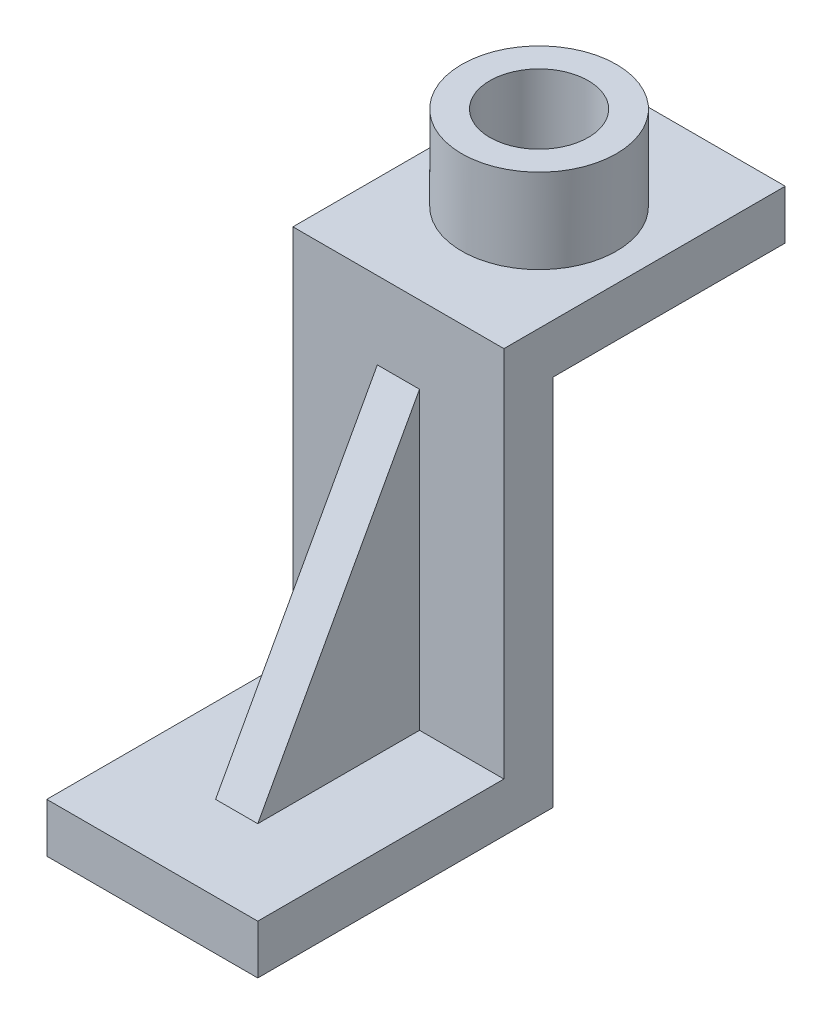
ISO-10303-21;
HEADER;
FILE_DESCRIPTION(('STEP AP214'),'2;1');
FILE_NAME('part.step','',(''),(''),'','','');
FILE_SCHEMA(('AUTOMOTIVE_DESIGN { 1 0 10303 214 1 1 1 1 }'));
ENDSEC;
DATA;
#1=APPLICATION_CONTEXT('core data for automotive mechanical design processes');
#2=APPLICATION_PROTOCOL_DEFINITION('international standard','automotive_design',2000,#1);
#3=PRODUCT_CONTEXT('',#1,'mechanical');
#4=PRODUCT('Part','Part','',(#3));
#5=PRODUCT_RELATED_PRODUCT_CATEGORY('part','',(#4));
#6=PRODUCT_DEFINITION_FORMATION('','',#4);
#7=PRODUCT_DEFINITION_CONTEXT('part definition',#1,'design');
#8=PRODUCT_DEFINITION('design','',#6,#7);
#9=PRODUCT_DEFINITION_SHAPE('','',#8);
#10=(LENGTH_UNIT() NAMED_UNIT(*) SI_UNIT(.MILLI.,.METRE.));
#11=(NAMED_UNIT(*) PLANE_ANGLE_UNIT() SI_UNIT($,.RADIAN.));
#12=(NAMED_UNIT(*) SI_UNIT($,.STERADIAN.) SOLID_ANGLE_UNIT());
#13=UNCERTAINTY_MEASURE_WITH_UNIT(LENGTH_MEASURE(1.E-05),#10,'distance_accuracy_value','');
#14=(GEOMETRIC_REPRESENTATION_CONTEXT(3) GLOBAL_UNCERTAINTY_ASSIGNED_CONTEXT((#13)) GLOBAL_UNIT_ASSIGNED_CONTEXT((#10,
#11,#12)) REPRESENTATION_CONTEXT('',''));
#15=CARTESIAN_POINT('',(0.,0.,0.));
#16=DIRECTION('',(0.,0.,1.));
#17=DIRECTION('',(1.,0.,0.));
#18=AXIS2_PLACEMENT_3D('',#15,#16,#17);
#19=CARTESIAN_POINT('',(0.,0.,7.));
#20=DIRECTION('',(0.,0.,-1.));
#21=DIRECTION('',(-1.,0.,0.));
#22=AXIS2_PLACEMENT_3D('',#19,#20,#21);
#23=PLANE('',#22);
#24=DIRECTION('',(-1.,0.,0.));
#25=VECTOR('',#24,1.);
#26=CARTESIAN_POINT('',(3.,19.,7.));
#27=LINE('',#26,#25);
#28=CARTESIAN_POINT('',(3.,19.,7.));
#29=VERTEX_POINT('',#28);
#30=CARTESIAN_POINT('',(-3.,19.,7.));
#31=VERTEX_POINT('',#30);
#32=EDGE_CURVE('E64',#29,#31,#27,.T.);
#33=ORIENTED_EDGE('',*,*,#32,.F.);
#34=DIRECTION('',(0.,1.,0.));
#35=VECTOR('',#34,1.);
#36=CARTESIAN_POINT('',(3.,-23.,7.));
#37=LINE('',#36,#35);
#38=CARTESIAN_POINT('',(3.,-23.,7.));
#39=VERTEX_POINT('',#38);
#40=EDGE_CURVE('E164',#39,#29,#37,.T.);
#41=ORIENTED_EDGE('',*,*,#40,.F.);
#42=DIRECTION('',(-1.,0.,0.));
#43=VECTOR('',#42,1.);
#44=CARTESIAN_POINT('',(15.,-23.,7.));
#45=LINE('',#44,#43);
#46=CARTESIAN_POINT('',(15.,-23.,7.));
#47=VERTEX_POINT('',#46);
#48=EDGE_CURVE('E188',#47,#39,#45,.T.);
#49=ORIENTED_EDGE('',*,*,#48,.F.);
#50=DIRECTION('',(0.,1.,0.));
#51=VECTOR('',#50,1.);
#52=CARTESIAN_POINT('',(15.,-30.,7.));
#53=LINE('',#52,#51);
#54=CARTESIAN_POINT('',(15.,30.,7.));
#55=VERTEX_POINT('',#54);
#56=EDGE_CURVE('E209',#47,#55,#53,.T.);
#57=ORIENTED_EDGE('',*,*,#56,.T.);
#58=DIRECTION('',(-1.,0.,0.));
#59=VECTOR('',#58,1.);
#60=CARTESIAN_POINT('',(-15.,30.,7.));
#61=LINE('',#60,#59);
#62=CARTESIAN_POINT('',(-15.,30.,7.));
#63=VERTEX_POINT('',#62);
#64=EDGE_CURVE('E212',#55,#63,#61,.T.);
#65=ORIENTED_EDGE('',*,*,#64,.T.);
#66=DIRECTION('',(0.,-1.,0.));
#67=VECTOR('',#66,1.);
#68=CARTESIAN_POINT('',(-15.,-30.,7.));
#69=LINE('',#68,#67);
#70=CARTESIAN_POINT('',(-15.,-23.,7.));
#71=VERTEX_POINT('',#70);
#72=EDGE_CURVE('E216',#63,#71,#69,.T.);
#73=ORIENTED_EDGE('',*,*,#72,.T.);
#74=CARTESIAN_POINT('',(-3.,-23.,7.));
#75=VERTEX_POINT('',#74);
#76=EDGE_CURVE('E182',#75,#71,#45,.T.);
#77=ORIENTED_EDGE('',*,*,#76,.F.);
#78=DIRECTION('',(0.,1.,0.));
#79=VECTOR('',#78,1.);
#80=CARTESIAN_POINT('',(-3.,-23.,7.));
#81=LINE('',#80,#79);
#82=EDGE_CURVE('E155',#75,#31,#81,.T.);
#83=ORIENTED_EDGE('',*,*,#82,.T.);
#84=EDGE_LOOP('',(#33,#41,#49,#57,#65,#73,#77,#83));
#85=FACE_BOUND('',#84,.T.);
#86=ADVANCED_FACE('F39',(#85),#23,.F.);
#87=CARTESIAN_POINT('',(15.,-30.,7.));
#88=DIRECTION('',(-1.,0.,0.));
#89=DIRECTION('',(0.,0.,1.));
#90=AXIS2_PLACEMENT_3D('',#87,#88,#89);
#91=PLANE('',#90);
#92=DIRECTION('',(0.,1.,0.));
#93=VECTOR('',#92,1.);
#94=CARTESIAN_POINT('',(15.,-30.,0.));
#95=LINE('',#94,#93);
#96=CARTESIAN_POINT('',(15.,-30.,0.));
#97=VERTEX_POINT('',#96);
#98=CARTESIAN_POINT('',(15.,23.,0.));
#99=VERTEX_POINT('',#98);
#100=EDGE_CURVE('E149',#97,#99,#95,.T.);
#101=ORIENTED_EDGE('',*,*,#100,.T.);
#102=DIRECTION('',(0.,0.,1.));
#103=VECTOR('',#102,1.);
#104=CARTESIAN_POINT('',(15.,23.,-33.));
#105=LINE('',#104,#103);
#106=CARTESIAN_POINT('',(15.,23.,-33.));
#107=VERTEX_POINT('',#106);
#108=EDGE_CURVE('E129',#107,#99,#105,.T.);
#109=ORIENTED_EDGE('',*,*,#108,.F.);
#110=DIRECTION('',(0.,-1.,0.));
#111=VECTOR('',#110,1.);
#112=CARTESIAN_POINT('',(15.,30.,-33.));
#113=LINE('',#112,#111);
#114=CARTESIAN_POINT('',(15.,30.,-33.));
#115=VERTEX_POINT('',#114);
#116=EDGE_CURVE('E137',#115,#107,#113,.T.);
#117=ORIENTED_EDGE('',*,*,#116,.F.);
#118=DIRECTION('',(0.,0.,-1.));
#119=VECTOR('',#118,1.);
#120=CARTESIAN_POINT('',(15.,30.,7.));
#121=LINE('',#120,#119);
#122=EDGE_CURVE('E49',#55,#115,#121,.T.);
#123=ORIENTED_EDGE('',*,*,#122,.F.);
#124=ORIENTED_EDGE('',*,*,#56,.F.);
#125=DIRECTION('',(0.,0.,-1.));
#126=VECTOR('',#125,1.);
#127=CARTESIAN_POINT('',(15.,-23.,42.));
#128=LINE('',#127,#126);
#129=CARTESIAN_POINT('',(15.,-23.,42.));
#130=VERTEX_POINT('',#129);
#131=EDGE_CURVE('E205',#130,#47,#128,.T.);
#132=ORIENTED_EDGE('',*,*,#131,.F.);
#133=DIRECTION('',(0.,1.,0.));
#134=VECTOR('',#133,1.);
#135=CARTESIAN_POINT('',(15.,-30.,42.));
#136=LINE('',#135,#134);
#137=CARTESIAN_POINT('',(15.,-30.,42.));
#138=VERTEX_POINT('',#137);
#139=EDGE_CURVE('E192',#138,#130,#136,.T.);
#140=ORIENTED_EDGE('',*,*,#139,.F.);
#141=DIRECTION('',(0.,0.,-1.));
#142=VECTOR('',#141,1.);
#143=CARTESIAN_POINT('',(15.,-30.,7.));
#144=LINE('',#143,#142);
#145=EDGE_CURVE('E220',#138,#97,#144,.T.);
#146=ORIENTED_EDGE('',*,*,#145,.T.);
#147=EDGE_LOOP('',(#101,#109,#117,#123,#124,#132,#140,#146));
#148=FACE_BOUND('',#147,.T.);
#149=ADVANCED_FACE('F41',(#148),#91,.F.);
#150=CARTESIAN_POINT('',(-15.,30.,7.));
#151=DIRECTION('',(0.,-1.,0.));
#152=DIRECTION('',(0.,0.,-1.));
#153=AXIS2_PLACEMENT_3D('',#150,#151,#152);
#154=PLANE('',#153);
#155=CARTESIAN_POINT('',(0.,30.,-13.));
#156=DIRECTION('',(0.,-1.,0.));
#157=DIRECTION('',(0.,0.,-1.));
#158=AXIS2_PLACEMENT_3D('',#155,#156,#157);
#159=CIRCLE('',#158,11.);
#160=CARTESIAN_POINT('',(0.,30.,-24.));
#161=VERTEX_POINT('',#160);
#162=EDGE_CURVE('E11',#161,#161,#159,.F.);
#163=ORIENTED_EDGE('',*,*,#162,.F.);
#164=EDGE_LOOP('',(#163));
#165=FACE_BOUND('',#164,.T.);
#166=ORIENTED_EDGE('',*,*,#122,.T.);
#167=DIRECTION('',(1.,0.,0.));
#168=VECTOR('',#167,1.);
#169=CARTESIAN_POINT('',(15.,30.,-33.));
#170=LINE('',#169,#168);
#171=CARTESIAN_POINT('',(-15.,30.,-33.));
#172=VERTEX_POINT('',#171);
#173=EDGE_CURVE('E143',#172,#115,#170,.T.);
#174=ORIENTED_EDGE('',*,*,#173,.F.);
#175=DIRECTION('',(0.,0.,-1.));
#176=VECTOR('',#175,1.);
#177=CARTESIAN_POINT('',(-15.,30.,7.));
#178=LINE('',#177,#176);
#179=EDGE_CURVE('E234',#63,#172,#178,.T.);
#180=ORIENTED_EDGE('',*,*,#179,.F.);
#181=ORIENTED_EDGE('',*,*,#64,.F.);
#182=EDGE_LOOP('',(#166,#174,#180,#181));
#183=FACE_BOUND('',#182,.T.);
#184=ADVANCED_FACE('F240',(#165,#183),#154,.F.);
#185=CARTESIAN_POINT('',(-15.,-30.,7.));
#186=DIRECTION('',(1.,0.,0.));
#187=DIRECTION('',(0.,0.,-1.));
#188=AXIS2_PLACEMENT_3D('',#185,#186,#187);
#189=PLANE('',#188);
#190=ORIENTED_EDGE('',*,*,#179,.T.);
#191=DIRECTION('',(0.,1.,0.));
#192=VECTOR('',#191,1.);
#193=CARTESIAN_POINT('',(-15.,30.,-33.));
#194=LINE('',#193,#192);
#195=CARTESIAN_POINT('',(-15.,23.,-33.));
#196=VERTEX_POINT('',#195);
#197=EDGE_CURVE('E136',#196,#172,#194,.T.);
#198=ORIENTED_EDGE('',*,*,#197,.F.);
#199=DIRECTION('',(0.,0.,1.));
#200=VECTOR('',#199,1.);
#201=CARTESIAN_POINT('',(-15.,23.,-33.));
#202=LINE('',#201,#200);
#203=CARTESIAN_POINT('',(-15.,23.,0.));
#204=VERTEX_POINT('',#203);
#205=EDGE_CURVE('E131',#196,#204,#202,.T.);
#206=ORIENTED_EDGE('',*,*,#205,.T.);
#207=DIRECTION('',(0.,-1.,0.));
#208=VECTOR('',#207,1.);
#209=CARTESIAN_POINT('',(-15.,-30.,0.));
#210=LINE('',#209,#208);
#211=CARTESIAN_POINT('',(-15.,-30.,0.));
#212=VERTEX_POINT('',#211);
#213=EDGE_CURVE('E223',#204,#212,#210,.T.);
#214=ORIENTED_EDGE('',*,*,#213,.T.);
#215=DIRECTION('',(0.,0.,-1.));
#216=VECTOR('',#215,1.);
#217=CARTESIAN_POINT('',(-15.,-30.,7.));
#218=LINE('',#217,#216);
#219=CARTESIAN_POINT('',(-15.,-30.,42.));
#220=VERTEX_POINT('',#219);
#221=EDGE_CURVE('E230',#220,#212,#218,.T.);
#222=ORIENTED_EDGE('',*,*,#221,.F.);
#223=DIRECTION('',(0.,-1.,0.));
#224=VECTOR('',#223,1.);
#225=CARTESIAN_POINT('',(-15.,-23.,42.));
#226=LINE('',#225,#224);
#227=CARTESIAN_POINT('',(-15.,-23.,42.));
#228=VERTEX_POINT('',#227);
#229=EDGE_CURVE('E183',#228,#220,#226,.T.);
#230=ORIENTED_EDGE('',*,*,#229,.F.);
#231=DIRECTION('',(0.,0.,-1.));
#232=VECTOR('',#231,1.);
#233=CARTESIAN_POINT('',(-15.,-23.,42.));
#234=LINE('',#233,#232);
#235=EDGE_CURVE('E198',#228,#71,#234,.T.);
#236=ORIENTED_EDGE('',*,*,#235,.T.);
#237=ORIENTED_EDGE('',*,*,#72,.F.);
#238=EDGE_LOOP('',(#190,#198,#206,#214,#222,#230,#236,#237));
#239=FACE_BOUND('',#238,.T.);
#240=ADVANCED_FACE('F258',(#239),#189,.F.);
#241=CARTESIAN_POINT('',(-15.,-30.,7.));
#242=DIRECTION('',(0.,1.,0.));
#243=DIRECTION('',(0.,0.,1.));
#244=AXIS2_PLACEMENT_3D('',#241,#242,#243);
#245=PLANE('',#244);
#246=DIRECTION('',(1.,0.,0.));
#247=VECTOR('',#246,1.);
#248=CARTESIAN_POINT('',(-15.,-30.,0.));
#249=LINE('',#248,#247);
#250=EDGE_CURVE('E213',#212,#97,#249,.T.);
#251=ORIENTED_EDGE('',*,*,#250,.T.);
#252=ORIENTED_EDGE('',*,*,#145,.F.);
#253=DIRECTION('',(1.,0.,0.));
#254=VECTOR('',#253,1.);
#255=CARTESIAN_POINT('',(-15.,-30.,42.));
#256=LINE('',#255,#254);
#257=EDGE_CURVE('E187',#220,#138,#256,.T.);
#258=ORIENTED_EDGE('',*,*,#257,.F.);
#259=ORIENTED_EDGE('',*,*,#221,.T.);
#260=EDGE_LOOP('',(#251,#252,#258,#259));
#261=FACE_BOUND('',#260,.T.);
#262=ADVANCED_FACE('F256',(#261),#245,.F.);
#263=CARTESIAN_POINT('',(0.,0.,0.));
#264=DIRECTION('',(0.,0.,-1.));
#265=DIRECTION('',(-1.,0.,0.));
#266=AXIS2_PLACEMENT_3D('',#263,#264,#265);
#267=PLANE('',#266);
#268=DIRECTION('',(-1.,0.,0.));
#269=VECTOR('',#268,1.);
#270=CARTESIAN_POINT('',(15.,23.,0.));
#271=LINE('',#270,#269);
#272=EDGE_CURVE('E56',#99,#204,#271,.T.);
#273=ORIENTED_EDGE('',*,*,#272,.F.);
#274=ORIENTED_EDGE('',*,*,#100,.F.);
#275=ORIENTED_EDGE('',*,*,#250,.F.);
#276=ORIENTED_EDGE('',*,*,#213,.F.);
#277=EDGE_LOOP('',(#273,#274,#275,#276));
#278=FACE_BOUND('',#277,.T.);
#279=ADVANCED_FACE('F255',(#278),#267,.T.);
#280=CARTESIAN_POINT('',(15.,-23.,42.));
#281=DIRECTION('',(0.,-1.,0.));
#282=DIRECTION('',(1.,0.,0.));
#283=AXIS2_PLACEMENT_3D('',#280,#281,#282);
#284=PLANE('',#283);
#285=ORIENTED_EDGE('',*,*,#48,.T.);
#286=DIRECTION('',(0.,0.,-1.));
#287=VECTOR('',#286,1.);
#288=CARTESIAN_POINT('',(3.,-23.,30.));
#289=LINE('',#288,#287);
#290=CARTESIAN_POINT('',(3.,-23.,30.));
#291=VERTEX_POINT('',#290);
#292=EDGE_CURVE('E160',#291,#39,#289,.T.);
#293=ORIENTED_EDGE('',*,*,#292,.F.);
#294=DIRECTION('',(-1.,0.,0.));
#295=VECTOR('',#294,1.);
#296=CARTESIAN_POINT('',(3.,-23.,30.));
#297=LINE('',#296,#295);
#298=CARTESIAN_POINT('',(-3.,-23.,30.));
#299=VERTEX_POINT('',#298);
#300=EDGE_CURVE('E171',#291,#299,#297,.T.);
#301=ORIENTED_EDGE('',*,*,#300,.T.);
#302=DIRECTION('',(0.,0.,-1.));
#303=VECTOR('',#302,1.);
#304=CARTESIAN_POINT('',(-3.,-23.,30.));
#305=LINE('',#304,#303);
#306=EDGE_CURVE('E151',#299,#75,#305,.T.);
#307=ORIENTED_EDGE('',*,*,#306,.T.);
#308=ORIENTED_EDGE('',*,*,#76,.T.);
#309=ORIENTED_EDGE('',*,*,#235,.F.);
#310=DIRECTION('',(-1.,0.,0.));
#311=VECTOR('',#310,1.);
#312=CARTESIAN_POINT('',(15.,-23.,42.));
#313=LINE('',#312,#311);
#314=EDGE_CURVE('E195',#130,#228,#313,.T.);
#315=ORIENTED_EDGE('',*,*,#314,.F.);
#316=ORIENTED_EDGE('',*,*,#131,.T.);
#317=EDGE_LOOP('',(#285,#293,#301,#307,#308,#309,#315,#316));
#318=FACE_BOUND('',#317,.T.);
#319=ADVANCED_FACE('F247',(#318),#284,.F.);
#320=CARTESIAN_POINT('',(0.,0.,42.));
#321=DIRECTION('',(0.,0.,1.));
#322=DIRECTION('',(1.,0.,0.));
#323=AXIS2_PLACEMENT_3D('',#320,#321,#322);
#324=PLANE('',#323);
#325=ORIENTED_EDGE('',*,*,#229,.T.);
#326=ORIENTED_EDGE('',*,*,#257,.T.);
#327=ORIENTED_EDGE('',*,*,#139,.T.);
#328=ORIENTED_EDGE('',*,*,#314,.T.);
#329=EDGE_LOOP('',(#325,#326,#327,#328));
#330=FACE_BOUND('',#329,.T.);
#331=ADVANCED_FACE('F251',(#330),#324,.T.);
#332=CARTESIAN_POINT('',(3.,19.,7.));
#333=DIRECTION('',(0.,-0.480314622865584,-0.877096267841502));
#334=DIRECTION('',(0.,0.877096267841502,-0.480314622865584));
#335=AXIS2_PLACEMENT_3D('',#332,#333,#334);
#336=PLANE('',#335);
#337=DIRECTION('',(0.,-0.877096267841502,0.480314622865584));
#338=VECTOR('',#337,1.);
#339=CARTESIAN_POINT('',(-3.,19.,7.));
#340=LINE('',#339,#338);
#341=EDGE_CURVE('E165',#31,#299,#340,.T.);
#342=ORIENTED_EDGE('',*,*,#341,.T.);
#343=ORIENTED_EDGE('',*,*,#300,.F.);
#344=DIRECTION('',(0.,-0.877096267841502,0.480314622865584));
#345=VECTOR('',#344,1.);
#346=CARTESIAN_POINT('',(3.,19.,7.));
#347=LINE('',#346,#345);
#348=EDGE_CURVE('E168',#29,#291,#347,.T.);
#349=ORIENTED_EDGE('',*,*,#348,.F.);
#350=ORIENTED_EDGE('',*,*,#32,.T.);
#351=EDGE_LOOP('',(#342,#343,#349,#350));
#352=FACE_BOUND('',#351,.T.);
#353=ADVANCED_FACE('F340',(#352),#336,.F.);
#354=CARTESIAN_POINT('',(3.,0.,0.));
#355=DIRECTION('',(1.,0.,0.));
#356=DIRECTION('',(0.,0.,-1.));
#357=AXIS2_PLACEMENT_3D('',#354,#355,#356);
#358=PLANE('',#357);
#359=ORIENTED_EDGE('',*,*,#292,.T.);
#360=ORIENTED_EDGE('',*,*,#40,.T.);
#361=ORIENTED_EDGE('',*,*,#348,.T.);
#362=EDGE_LOOP('',(#359,#360,#361));
#363=FACE_BOUND('',#362,.T.);
#364=ADVANCED_FACE('F345',(#363),#358,.T.);
#365=CARTESIAN_POINT('',(-3.,0.,0.));
#366=DIRECTION('',(1.,0.,0.));
#367=DIRECTION('',(0.,0.,-1.));
#368=AXIS2_PLACEMENT_3D('',#365,#366,#367);
#369=PLANE('',#368);
#370=ORIENTED_EDGE('',*,*,#306,.F.);
#371=ORIENTED_EDGE('',*,*,#341,.F.);
#372=ORIENTED_EDGE('',*,*,#82,.F.);
#373=EDGE_LOOP('',(#370,#371,#372));
#374=FACE_BOUND('',#373,.T.);
#375=ADVANCED_FACE('F353',(#374),#369,.F.);
#376=CARTESIAN_POINT('',(15.,23.,-33.));
#377=DIRECTION('',(0.,1.,0.));
#378=DIRECTION('',(0.,0.,1.));
#379=AXIS2_PLACEMENT_3D('',#376,#377,#378);
#380=PLANE('',#379);
#381=CARTESIAN_POINT('',(0.,23.,-13.));
#382=DIRECTION('',(0.,1.,0.));
#383=DIRECTION('',(0.,0.,1.));
#384=AXIS2_PLACEMENT_3D('',#381,#382,#383);
#385=CIRCLE('',#384,7.);
#386=CARTESIAN_POINT('',(0.,23.,-6.));
#387=VERTEX_POINT('',#386);
#388=EDGE_CURVE('E43',#387,#387,#385,.T.);
#389=ORIENTED_EDGE('',*,*,#388,.T.);
#390=EDGE_LOOP('',(#389));
#391=FACE_BOUND('',#390,.T.);
#392=ORIENTED_EDGE('',*,*,#272,.T.);
#393=ORIENTED_EDGE('',*,*,#205,.F.);
#394=DIRECTION('',(-1.,0.,0.));
#395=VECTOR('',#394,1.);
#396=CARTESIAN_POINT('',(15.,23.,-33.));
#397=LINE('',#396,#395);
#398=EDGE_CURVE('E125',#107,#196,#397,.T.);
#399=ORIENTED_EDGE('',*,*,#398,.F.);
#400=ORIENTED_EDGE('',*,*,#108,.T.);
#401=EDGE_LOOP('',(#392,#393,#399,#400));
#402=FACE_BOUND('',#401,.T.);
#403=ADVANCED_FACE('F127',(#391,#402),#380,.F.);
#404=CARTESIAN_POINT('',(0.,0.,-33.));
#405=DIRECTION('',(0.,0.,-1.));
#406=DIRECTION('',(-1.,0.,0.));
#407=AXIS2_PLACEMENT_3D('',#404,#405,#406);
#408=PLANE('',#407);
#409=ORIENTED_EDGE('',*,*,#116,.T.);
#410=ORIENTED_EDGE('',*,*,#398,.T.);
#411=ORIENTED_EDGE('',*,*,#197,.T.);
#412=ORIENTED_EDGE('',*,*,#173,.T.);
#413=EDGE_LOOP('',(#409,#410,#411,#412));
#414=FACE_BOUND('',#413,.T.);
#415=ADVANCED_FACE('F141',(#414),#408,.T.);
#416=CARTESIAN_POINT('',(0.,42.,-13.));
#417=DIRECTION('',(0.,1.,0.));
#418=DIRECTION('',(0.,0.,1.));
#419=AXIS2_PLACEMENT_3D('',#416,#417,#418);
#420=PLANE('',#419);
#421=CARTESIAN_POINT('',(0.,42.,-13.));
#422=DIRECTION('',(0.,1.,0.));
#423=DIRECTION('',(0.,0.,1.));
#424=AXIS2_PLACEMENT_3D('',#421,#422,#423);
#425=CIRCLE('',#424,11.);
#426=CARTESIAN_POINT('',(0.,42.,-2.));
#427=VERTEX_POINT('',#426);
#428=EDGE_CURVE('E265',#427,#427,#425,.T.);
#429=ORIENTED_EDGE('',*,*,#428,.T.);
#430=EDGE_LOOP('',(#429));
#431=FACE_BOUND('',#430,.T.);
#432=CARTESIAN_POINT('',(0.,42.,-13.));
#433=DIRECTION('',(0.,1.,0.));
#434=DIRECTION('',(0.,0.,1.));
#435=AXIS2_PLACEMENT_3D('',#432,#433,#434);
#436=CIRCLE('',#435,7.);
#437=CARTESIAN_POINT('',(0.,42.,-6.));
#438=VERTEX_POINT('',#437);
#439=EDGE_CURVE('E268',#438,#438,#436,.T.);
#440=ORIENTED_EDGE('',*,*,#439,.F.);
#441=EDGE_LOOP('',(#440));
#442=FACE_BOUND('',#441,.T.);
#443=ADVANCED_FACE('F289',(#431,#442),#420,.T.);
#444=CARTESIAN_POINT('',(0.,42.,-13.));
#445=DIRECTION('',(0.,-1.,0.));
#446=DIRECTION('',(0.,0.,-1.));
#447=AXIS2_PLACEMENT_3D('',#444,#445,#446);
#448=CYLINDRICAL_SURFACE('',#447,11.);
#449=ORIENTED_EDGE('',*,*,#428,.F.);
#450=EDGE_LOOP('',(#449));
#451=FACE_BOUND('',#450,.T.);
#452=ORIENTED_EDGE('',*,*,#162,.T.);
#453=EDGE_LOOP('',(#452));
#454=FACE_BOUND('',#453,.T.);
#455=ADVANCED_FACE('F284',(#451,#454),#448,.T.);
#456=CARTESIAN_POINT('',(0.,42.,-13.));
#457=DIRECTION('',(0.,-1.,0.));
#458=DIRECTION('',(0.,0.,-1.));
#459=AXIS2_PLACEMENT_3D('',#456,#457,#458);
#460=CYLINDRICAL_SURFACE('',#459,7.);
#461=ORIENTED_EDGE('',*,*,#439,.T.);
#462=EDGE_LOOP('',(#461));
#463=FACE_BOUND('',#462,.T.);
#464=ORIENTED_EDGE('',*,*,#388,.F.);
#465=EDGE_LOOP('',(#464));
#466=FACE_BOUND('',#465,.T.);
#467=ADVANCED_FACE('F282',(#463,#466),#460,.F.);
#468=CLOSED_SHELL('',(#86,#149,#184,#240,#262,#279,#319,#331,#353,#364,#375,#403,#415,#443,#455,#467));
#469=MANIFOLD_SOLID_BREP('B2',#468);
#470=ADVANCED_BREP_SHAPE_REPRESENTATION('',(#18,#469),#14);
#471=SHAPE_DEFINITION_REPRESENTATION(#9,#470);
ENDSEC;
END-ISO-10303-21;
